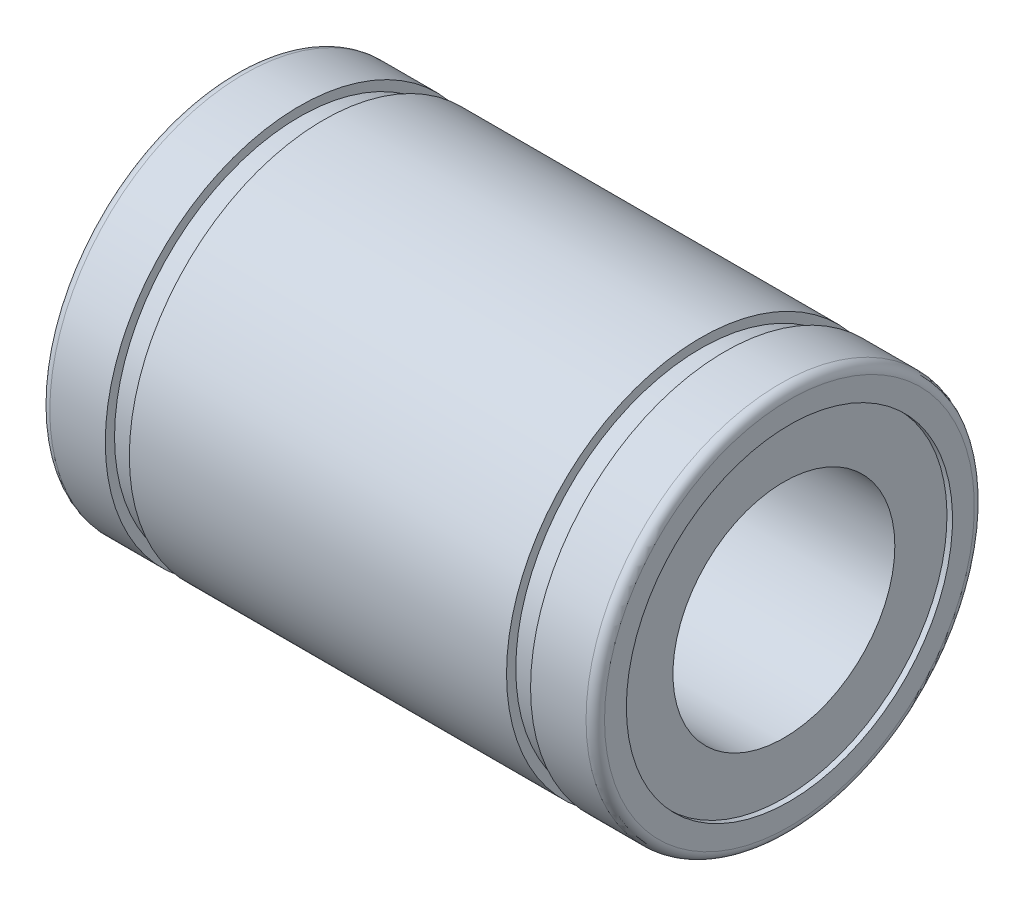
ISO-10303-21;
HEADER;
FILE_DESCRIPTION(('STEP AP214'),'2;1');
FILE_NAME('part.step','',(''),(''),'','','');
FILE_SCHEMA(('AUTOMOTIVE_DESIGN { 1 0 10303 214 1 1 1 1 }'));
ENDSEC;
DATA;
#1=APPLICATION_CONTEXT('core data for automotive mechanical design processes');
#2=APPLICATION_PROTOCOL_DEFINITION('international standard','automotive_design',2000,#1);
#3=PRODUCT_CONTEXT('',#1,'mechanical');
#4=PRODUCT('Part','Part','',(#3));
#5=PRODUCT_RELATED_PRODUCT_CATEGORY('part','',(#4));
#6=PRODUCT_DEFINITION_FORMATION('','',#4);
#7=PRODUCT_DEFINITION_CONTEXT('part definition',#1,'design');
#8=PRODUCT_DEFINITION('design','',#6,#7);
#9=PRODUCT_DEFINITION_SHAPE('','',#8);
#10=(LENGTH_UNIT() NAMED_UNIT(*) SI_UNIT(.MILLI.,.METRE.));
#11=(NAMED_UNIT(*) PLANE_ANGLE_UNIT() SI_UNIT($,.RADIAN.));
#12=(NAMED_UNIT(*) SI_UNIT($,.STERADIAN.) SOLID_ANGLE_UNIT());
#13=UNCERTAINTY_MEASURE_WITH_UNIT(LENGTH_MEASURE(1.E-05),#10,'distance_accuracy_value','');
#14=(GEOMETRIC_REPRESENTATION_CONTEXT(3) GLOBAL_UNCERTAINTY_ASSIGNED_CONTEXT((#13)) GLOBAL_UNIT_ASSIGNED_CONTEXT((#10,
#11,#12)) REPRESENTATION_CONTEXT('',''));
#15=CARTESIAN_POINT('',(0.,0.,0.));
#16=DIRECTION('',(0.,0.,1.));
#17=DIRECTION('',(1.,0.,0.));
#18=AXIS2_PLACEMENT_3D('',#15,#16,#17);
#19=CARTESIAN_POINT('',(-14.5,0.,0.));
#20=DIRECTION('',(-1.,0.,0.));
#21=DIRECTION('',(0.,0.,1.));
#22=AXIS2_PLACEMENT_3D('',#19,#20,#21);
#23=TOROIDAL_SURFACE('',#22,10.,0.5);
#24=CARTESIAN_POINT('',(-15.,0.,0.));
#25=DIRECTION('',(-1.,0.,0.));
#26=DIRECTION('',(0.,0.,1.));
#27=AXIS2_PLACEMENT_3D('',#24,#25,#26);
#28=CIRCLE('',#27,10.);
#29=CARTESIAN_POINT('',(-15.,0.,10.));
#30=VERTEX_POINT('',#29);
#31=EDGE_CURVE('E9',#30,#30,#28,.T.);
#32=ORIENTED_EDGE('',*,*,#31,.F.);
#33=EDGE_LOOP('',(#32));
#34=FACE_BOUND('',#33,.T.);
#35=CARTESIAN_POINT('',(-14.5,0.,0.));
#36=DIRECTION('',(-1.,0.,0.));
#37=DIRECTION('',(0.,0.,1.));
#38=AXIS2_PLACEMENT_3D('',#35,#36,#37);
#39=CIRCLE('',#38,10.5);
#40=CARTESIAN_POINT('',(-14.5,0.,10.5));
#41=VERTEX_POINT('',#40);
#42=EDGE_CURVE('E38',#41,#41,#39,.T.);
#43=ORIENTED_EDGE('',*,*,#42,.T.);
#44=EDGE_LOOP('',(#43));
#45=FACE_BOUND('',#44,.T.);
#46=ADVANCED_FACE('F13',(#34,#45),#23,.T.);
#47=CARTESIAN_POINT('',(-15.,10.,0.));
#48=DIRECTION('',(1.,0.,0.));
#49=DIRECTION('',(0.,0.,-1.));
#50=AXIS2_PLACEMENT_3D('',#47,#48,#49);
#51=PLANE('',#50);
#52=CARTESIAN_POINT('',(-15.,0.,0.));
#53=DIRECTION('',(1.,0.,0.));
#54=DIRECTION('',(0.,0.,-1.));
#55=AXIS2_PLACEMENT_3D('',#52,#53,#54);
#56=CIRCLE('',#55,8.82);
#57=CARTESIAN_POINT('',(-15.,0.,-8.82));
#58=VERTEX_POINT('',#57);
#59=EDGE_CURVE('E39',#58,#58,#56,.T.);
#60=ORIENTED_EDGE('',*,*,#59,.T.);
#61=EDGE_LOOP('',(#60));
#62=FACE_BOUND('',#61,.T.);
#63=ORIENTED_EDGE('',*,*,#31,.T.);
#64=EDGE_LOOP('',(#63));
#65=FACE_BOUND('',#64,.T.);
#66=ADVANCED_FACE('F107',(#62,#65),#51,.F.);
#67=CARTESIAN_POINT('',(15.,0.,0.));
#68=DIRECTION('',(-1.,0.,0.));
#69=DIRECTION('',(0.,0.,1.));
#70=AXIS2_PLACEMENT_3D('',#67,#68,#69);
#71=PLANE('',#70);
#72=CARTESIAN_POINT('',(15.,0.,0.));
#73=DIRECTION('',(-1.,0.,0.));
#74=DIRECTION('',(0.,0.,1.));
#75=AXIS2_PLACEMENT_3D('',#72,#73,#74);
#76=CIRCLE('',#75,8.82);
#77=CARTESIAN_POINT('',(15.,0.,8.82));
#78=VERTEX_POINT('',#77);
#79=EDGE_CURVE('E35',#78,#78,#76,.T.);
#80=ORIENTED_EDGE('',*,*,#79,.T.);
#81=EDGE_LOOP('',(#80));
#82=FACE_BOUND('',#81,.T.);
#83=CARTESIAN_POINT('',(15.,0.,0.));
#84=DIRECTION('',(-1.,0.,0.));
#85=DIRECTION('',(0.,0.,1.));
#86=AXIS2_PLACEMENT_3D('',#83,#84,#85);
#87=CIRCLE('',#86,10.);
#88=CARTESIAN_POINT('',(15.,0.,10.));
#89=VERTEX_POINT('',#88);
#90=EDGE_CURVE('E21',#89,#89,#87,.T.);
#91=ORIENTED_EDGE('',*,*,#90,.F.);
#92=EDGE_LOOP('',(#91));
#93=FACE_BOUND('',#92,.T.);
#94=ADVANCED_FACE('F102',(#82,#93),#71,.F.);
#95=CARTESIAN_POINT('',(14.5,0.,0.));
#96=DIRECTION('',(-1.,0.,0.));
#97=DIRECTION('',(0.,0.,1.));
#98=AXIS2_PLACEMENT_3D('',#95,#96,#97);
#99=TOROIDAL_SURFACE('',#98,10.,0.5);
#100=CARTESIAN_POINT('',(14.5,0.,0.));
#101=DIRECTION('',(-1.,0.,0.));
#102=DIRECTION('',(0.,0.,1.));
#103=AXIS2_PLACEMENT_3D('',#100,#101,#102);
#104=CIRCLE('',#103,10.5);
#105=CARTESIAN_POINT('',(14.5,0.,10.5));
#106=VERTEX_POINT('',#105);
#107=EDGE_CURVE('E31',#106,#106,#104,.T.);
#108=ORIENTED_EDGE('',*,*,#107,.F.);
#109=EDGE_LOOP('',(#108));
#110=FACE_BOUND('',#109,.T.);
#111=ORIENTED_EDGE('',*,*,#90,.T.);
#112=EDGE_LOOP('',(#111));
#113=FACE_BOUND('',#112,.T.);
#114=ADVANCED_FACE('F99',(#110,#113),#99,.T.);
#115=CARTESIAN_POINT('',(0.,0.,0.));
#116=DIRECTION('',(-1.,0.,0.));
#117=DIRECTION('',(0.,0.,1.));
#118=AXIS2_PLACEMENT_3D('',#115,#116,#117);
#119=CYLINDRICAL_SURFACE('',#118,10.5);
#120=CARTESIAN_POINT('',(11.5,0.,0.));
#121=DIRECTION('',(-1.,0.,0.));
#122=DIRECTION('',(0.,0.,1.));
#123=AXIS2_PLACEMENT_3D('',#120,#121,#122);
#124=CIRCLE('',#123,10.5);
#125=CARTESIAN_POINT('',(11.5,0.,10.5));
#126=VERTEX_POINT('',#125);
#127=EDGE_CURVE('E89',#126,#126,#124,.T.);
#128=ORIENTED_EDGE('',*,*,#127,.F.);
#129=EDGE_LOOP('',(#128));
#130=FACE_BOUND('',#129,.T.);
#131=ORIENTED_EDGE('',*,*,#107,.T.);
#132=EDGE_LOOP('',(#131));
#133=FACE_BOUND('',#132,.T.);
#134=ADVANCED_FACE('F97',(#130,#133),#119,.T.);
#135=CARTESIAN_POINT('',(11.5,10.,0.));
#136=DIRECTION('',(-1.,0.,0.));
#137=DIRECTION('',(0.,0.,1.));
#138=AXIS2_PLACEMENT_3D('',#135,#136,#137);
#139=PLANE('',#138);
#140=ORIENTED_EDGE('',*,*,#127,.T.);
#141=EDGE_LOOP('',(#140));
#142=FACE_BOUND('',#141,.T.);
#143=CARTESIAN_POINT('',(11.5,0.,0.));
#144=DIRECTION('',(-1.,0.,0.));
#145=DIRECTION('',(0.,0.,1.));
#146=AXIS2_PLACEMENT_3D('',#143,#144,#145);
#147=CIRCLE('',#146,10.);
#148=CARTESIAN_POINT('',(11.5,0.,10.));
#149=VERTEX_POINT('',#148);
#150=EDGE_CURVE('E85',#149,#149,#147,.T.);
#151=ORIENTED_EDGE('',*,*,#150,.F.);
#152=EDGE_LOOP('',(#151));
#153=FACE_BOUND('',#152,.T.);
#154=ADVANCED_FACE('F155',(#142,#153),#139,.T.);
#155=CARTESIAN_POINT('',(0.,0.,0.));
#156=DIRECTION('',(-1.,0.,0.));
#157=DIRECTION('',(0.,0.,1.));
#158=AXIS2_PLACEMENT_3D('',#155,#156,#157);
#159=CYLINDRICAL_SURFACE('',#158,10.);
#160=ORIENTED_EDGE('',*,*,#150,.T.);
#161=EDGE_LOOP('',(#160));
#162=FACE_BOUND('',#161,.T.);
#163=CARTESIAN_POINT('',(10.2,0.,0.));
#164=DIRECTION('',(-1.,0.,0.));
#165=DIRECTION('',(0.,0.,1.));
#166=AXIS2_PLACEMENT_3D('',#163,#164,#165);
#167=CIRCLE('',#166,10.);
#168=CARTESIAN_POINT('',(10.2,0.,10.));
#169=VERTEX_POINT('',#168);
#170=EDGE_CURVE('E81',#169,#169,#167,.T.);
#171=ORIENTED_EDGE('',*,*,#170,.F.);
#172=EDGE_LOOP('',(#171));
#173=FACE_BOUND('',#172,.T.);
#174=ADVANCED_FACE('F151',(#162,#173),#159,.T.);
#175=CARTESIAN_POINT('',(10.2,10.5,0.));
#176=DIRECTION('',(1.,0.,0.));
#177=DIRECTION('',(0.,0.,-1.));
#178=AXIS2_PLACEMENT_3D('',#175,#176,#177);
#179=PLANE('',#178);
#180=ORIENTED_EDGE('',*,*,#170,.T.);
#181=EDGE_LOOP('',(#180));
#182=FACE_BOUND('',#181,.T.);
#183=CARTESIAN_POINT('',(10.2,0.,0.));
#184=DIRECTION('',(-1.,0.,0.));
#185=DIRECTION('',(0.,0.,1.));
#186=AXIS2_PLACEMENT_3D('',#183,#184,#185);
#187=CIRCLE('',#186,10.5);
#188=CARTESIAN_POINT('',(10.2,0.,10.5));
#189=VERTEX_POINT('',#188);
#190=EDGE_CURVE('E77',#189,#189,#187,.T.);
#191=ORIENTED_EDGE('',*,*,#190,.F.);
#192=EDGE_LOOP('',(#191));
#193=FACE_BOUND('',#192,.T.);
#194=ADVANCED_FACE('F147',(#182,#193),#179,.T.);
#195=CARTESIAN_POINT('',(0.,0.,0.));
#196=DIRECTION('',(-1.,0.,0.));
#197=DIRECTION('',(0.,0.,1.));
#198=AXIS2_PLACEMENT_3D('',#195,#196,#197);
#199=CYLINDRICAL_SURFACE('',#198,10.5);
#200=CARTESIAN_POINT('',(-10.2,0.,0.));
#201=DIRECTION('',(-1.,0.,0.));
#202=DIRECTION('',(0.,0.,1.));
#203=AXIS2_PLACEMENT_3D('',#200,#201,#202);
#204=CIRCLE('',#203,10.5);
#205=CARTESIAN_POINT('',(-10.2,0.,10.5));
#206=VERTEX_POINT('',#205);
#207=EDGE_CURVE('E73',#206,#206,#204,.T.);
#208=ORIENTED_EDGE('',*,*,#207,.F.);
#209=EDGE_LOOP('',(#208));
#210=FACE_BOUND('',#209,.T.);
#211=ORIENTED_EDGE('',*,*,#190,.T.);
#212=EDGE_LOOP('',(#211));
#213=FACE_BOUND('',#212,.T.);
#214=ADVANCED_FACE('F143',(#210,#213),#199,.T.);
#215=CARTESIAN_POINT('',(-10.2,10.,0.));
#216=DIRECTION('',(-1.,0.,0.));
#217=DIRECTION('',(0.,0.,1.));
#218=AXIS2_PLACEMENT_3D('',#215,#216,#217);
#219=PLANE('',#218);
#220=ORIENTED_EDGE('',*,*,#207,.T.);
#221=EDGE_LOOP('',(#220));
#222=FACE_BOUND('',#221,.T.);
#223=CARTESIAN_POINT('',(-10.2,0.,0.));
#224=DIRECTION('',(-1.,0.,0.));
#225=DIRECTION('',(0.,0.,1.));
#226=AXIS2_PLACEMENT_3D('',#223,#224,#225);
#227=CIRCLE('',#226,10.);
#228=CARTESIAN_POINT('',(-10.2,0.,10.));
#229=VERTEX_POINT('',#228);
#230=EDGE_CURVE('E69',#229,#229,#227,.T.);
#231=ORIENTED_EDGE('',*,*,#230,.F.);
#232=EDGE_LOOP('',(#231));
#233=FACE_BOUND('',#232,.T.);
#234=ADVANCED_FACE('F136',(#222,#233),#219,.T.);
#235=CARTESIAN_POINT('',(0.,0.,0.));
#236=DIRECTION('',(-1.,0.,0.));
#237=DIRECTION('',(0.,0.,1.));
#238=AXIS2_PLACEMENT_3D('',#235,#236,#237);
#239=CYLINDRICAL_SURFACE('',#238,10.);
#240=ORIENTED_EDGE('',*,*,#230,.T.);
#241=EDGE_LOOP('',(#240));
#242=FACE_BOUND('',#241,.T.);
#243=CARTESIAN_POINT('',(-11.5,0.,0.));
#244=DIRECTION('',(-1.,0.,0.));
#245=DIRECTION('',(0.,0.,1.));
#246=AXIS2_PLACEMENT_3D('',#243,#244,#245);
#247=CIRCLE('',#246,10.);
#248=CARTESIAN_POINT('',(-11.5,0.,10.));
#249=VERTEX_POINT('',#248);
#250=EDGE_CURVE('E65',#249,#249,#247,.T.);
#251=ORIENTED_EDGE('',*,*,#250,.F.);
#252=EDGE_LOOP('',(#251));
#253=FACE_BOUND('',#252,.T.);
#254=ADVANCED_FACE('F130',(#242,#253),#239,.T.);
#255=CARTESIAN_POINT('',(-11.5,10.5,0.));
#256=DIRECTION('',(1.,0.,0.));
#257=DIRECTION('',(0.,0.,-1.));
#258=AXIS2_PLACEMENT_3D('',#255,#256,#257);
#259=PLANE('',#258);
#260=ORIENTED_EDGE('',*,*,#250,.T.);
#261=EDGE_LOOP('',(#260));
#262=FACE_BOUND('',#261,.T.);
#263=CARTESIAN_POINT('',(-11.5,0.,0.));
#264=DIRECTION('',(-1.,0.,0.));
#265=DIRECTION('',(0.,0.,1.));
#266=AXIS2_PLACEMENT_3D('',#263,#264,#265);
#267=CIRCLE('',#266,10.5);
#268=CARTESIAN_POINT('',(-11.5,0.,10.5));
#269=VERTEX_POINT('',#268);
#270=EDGE_CURVE('E62',#269,#269,#267,.T.);
#271=ORIENTED_EDGE('',*,*,#270,.F.);
#272=EDGE_LOOP('',(#271));
#273=FACE_BOUND('',#272,.T.);
#274=ADVANCED_FACE('F125',(#262,#273),#259,.T.);
#275=CARTESIAN_POINT('',(0.,0.,0.));
#276=DIRECTION('',(-1.,0.,0.));
#277=DIRECTION('',(0.,0.,1.));
#278=AXIS2_PLACEMENT_3D('',#275,#276,#277);
#279=CYLINDRICAL_SURFACE('',#278,10.5);
#280=ORIENTED_EDGE('',*,*,#42,.F.);
#281=EDGE_LOOP('',(#280));
#282=FACE_BOUND('',#281,.T.);
#283=ORIENTED_EDGE('',*,*,#270,.T.);
#284=EDGE_LOOP('',(#283));
#285=FACE_BOUND('',#284,.T.);
#286=ADVANCED_FACE('F121',(#282,#285),#279,.T.);
#287=CARTESIAN_POINT('',(13.5,0.,0.));
#288=DIRECTION('',(1.,0.,0.));
#289=DIRECTION('',(0.,-1.,0.));
#290=AXIS2_PLACEMENT_3D('',#287,#288,#289);
#291=CYLINDRICAL_SURFACE('',#290,8.82);
#292=CARTESIAN_POINT('',(14.7,0.,0.));
#293=DIRECTION('',(-1.,0.,0.));
#294=DIRECTION('',(0.,-1.,0.));
#295=AXIS2_PLACEMENT_3D('',#292,#293,#294);
#296=CIRCLE('',#295,8.82);
#297=CARTESIAN_POINT('',(14.7,-8.82,0.));
#298=VERTEX_POINT('',#297);
#299=EDGE_CURVE('E42',#298,#298,#296,.T.);
#300=ORIENTED_EDGE('',*,*,#299,.T.);
#301=EDGE_LOOP('',(#300));
#302=FACE_BOUND('',#301,.T.);
#303=ORIENTED_EDGE('',*,*,#79,.F.);
#304=EDGE_LOOP('',(#303));
#305=FACE_BOUND('',#304,.T.);
#306=ADVANCED_FACE('F124',(#302,#305),#291,.F.);
#307=CARTESIAN_POINT('',(-13.5,0.,0.));
#308=DIRECTION('',(-1.,0.,0.));
#309=DIRECTION('',(0.,-1.,0.));
#310=AXIS2_PLACEMENT_3D('',#307,#308,#309);
#311=CYLINDRICAL_SURFACE('',#310,8.82);
#312=CARTESIAN_POINT('',(-14.7,0.,0.));
#313=DIRECTION('',(1.,0.,0.));
#314=DIRECTION('',(0.,-1.,0.));
#315=AXIS2_PLACEMENT_3D('',#312,#313,#314);
#316=CIRCLE('',#315,8.82);
#317=CARTESIAN_POINT('',(-14.7,-8.82,0.));
#318=VERTEX_POINT('',#317);
#319=EDGE_CURVE('E48',#318,#318,#316,.T.);
#320=ORIENTED_EDGE('',*,*,#319,.T.);
#321=EDGE_LOOP('',(#320));
#322=FACE_BOUND('',#321,.T.);
#323=ORIENTED_EDGE('',*,*,#59,.F.);
#324=EDGE_LOOP('',(#323));
#325=FACE_BOUND('',#324,.T.);
#326=ADVANCED_FACE('F222',(#322,#325),#311,.F.);
#327=CARTESIAN_POINT('',(14.7,0.,0.));
#328=DIRECTION('',(1.,0.,0.));
#329=DIRECTION('',(0.,0.,-1.));
#330=AXIS2_PLACEMENT_3D('',#327,#328,#329);
#331=PLANE('',#330);
#332=CARTESIAN_POINT('',(14.7,0.,0.));
#333=DIRECTION('',(1.,0.,0.));
#334=DIRECTION('',(0.,0.,-1.));
#335=AXIS2_PLACEMENT_3D('',#332,#333,#334);
#336=CIRCLE('',#335,6.);
#337=CARTESIAN_POINT('',(14.7,0.,-6.));
#338=VERTEX_POINT('',#337);
#339=EDGE_CURVE('E56',#338,#338,#336,.T.);
#340=ORIENTED_EDGE('',*,*,#339,.F.);
#341=EDGE_LOOP('',(#340));
#342=FACE_BOUND('',#341,.T.);
#343=ORIENTED_EDGE('',*,*,#299,.F.);
#344=EDGE_LOOP('',(#343));
#345=FACE_BOUND('',#344,.T.);
#346=ADVANCED_FACE('F230',(#342,#345),#331,.T.);
#347=CARTESIAN_POINT('',(-14.7,0.,0.));
#348=DIRECTION('',(-1.,0.,0.));
#349=DIRECTION('',(0.,0.,1.));
#350=AXIS2_PLACEMENT_3D('',#347,#348,#349);
#351=PLANE('',#350);
#352=CARTESIAN_POINT('',(-14.7,0.,0.));
#353=DIRECTION('',(-1.,0.,0.));
#354=DIRECTION('',(0.,0.,1.));
#355=AXIS2_PLACEMENT_3D('',#352,#353,#354);
#356=CIRCLE('',#355,6.);
#357=CARTESIAN_POINT('',(-14.7,0.,6.));
#358=VERTEX_POINT('',#357);
#359=EDGE_CURVE('E16',#358,#358,#356,.T.);
#360=ORIENTED_EDGE('',*,*,#359,.F.);
#361=EDGE_LOOP('',(#360));
#362=FACE_BOUND('',#361,.T.);
#363=ORIENTED_EDGE('',*,*,#319,.F.);
#364=EDGE_LOOP('',(#363));
#365=FACE_BOUND('',#364,.T.);
#366=ADVANCED_FACE('F240',(#362,#365),#351,.T.);
#367=CARTESIAN_POINT('',(-30.,0.,0.));
#368=DIRECTION('',(1.,0.,0.));
#369=DIRECTION('',(0.,-1.,0.));
#370=AXIS2_PLACEMENT_3D('',#367,#368,#369);
#371=CYLINDRICAL_SURFACE('',#370,6.);
#372=ORIENTED_EDGE('',*,*,#339,.T.);
#373=EDGE_LOOP('',(#372));
#374=FACE_BOUND('',#373,.T.);
#375=ORIENTED_EDGE('',*,*,#359,.T.);
#376=EDGE_LOOP('',(#375));
#377=FACE_BOUND('',#376,.T.);
#378=ADVANCED_FACE('F249',(#374,#377),#371,.F.);
#379=CLOSED_SHELL('',(#46,#66,#94,#114,#134,#154,#174,#194,#214,#234,#254,#274,#286,#306,#326,
#346,#366,#378));
#380=MANIFOLD_SOLID_BREP('B1',#379);
#381=ADVANCED_BREP_SHAPE_REPRESENTATION('',(#18,#380),#14);
#382=SHAPE_DEFINITION_REPRESENTATION(#9,#381);
ENDSEC;
END-ISO-10303-21;
